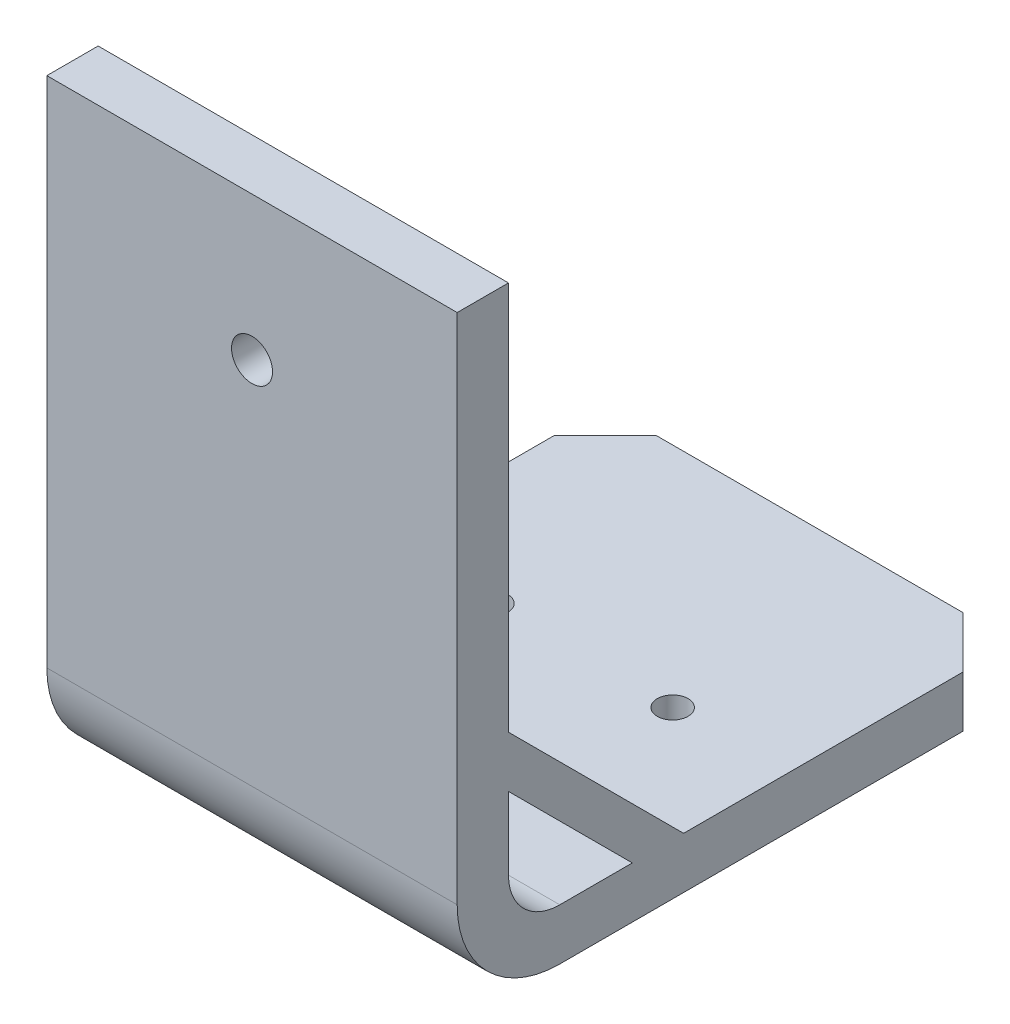
ISO-10303-21;
HEADER;
FILE_DESCRIPTION(('STEP AP214'),'2;1');
FILE_NAME('part.step','',(''),(''),'','','');
FILE_SCHEMA(('AUTOMOTIVE_DESIGN { 1 0 10303 214 1 1 1 1 }'));
ENDSEC;
DATA;
#1=APPLICATION_CONTEXT('core data for automotive mechanical design processes');
#2=APPLICATION_PROTOCOL_DEFINITION('international standard','automotive_design',2000,#1);
#3=PRODUCT_CONTEXT('',#1,'mechanical');
#4=PRODUCT('Part','Part','',(#3));
#5=PRODUCT_RELATED_PRODUCT_CATEGORY('part','',(#4));
#6=PRODUCT_DEFINITION_FORMATION('','',#4);
#7=PRODUCT_DEFINITION_CONTEXT('part definition',#1,'design');
#8=PRODUCT_DEFINITION('design','',#6,#7);
#9=PRODUCT_DEFINITION_SHAPE('','',#8);
#10=(LENGTH_UNIT() NAMED_UNIT(*) SI_UNIT(.MILLI.,.METRE.));
#11=(NAMED_UNIT(*) PLANE_ANGLE_UNIT() SI_UNIT($,.RADIAN.));
#12=(NAMED_UNIT(*) SI_UNIT($,.STERADIAN.) SOLID_ANGLE_UNIT());
#13=UNCERTAINTY_MEASURE_WITH_UNIT(LENGTH_MEASURE(1.E-05),#10,'distance_accuracy_value','');
#14=(GEOMETRIC_REPRESENTATION_CONTEXT(3) GLOBAL_UNCERTAINTY_ASSIGNED_CONTEXT((#13)) GLOBAL_UNIT_ASSIGNED_CONTEXT((#10,
#11,#12)) REPRESENTATION_CONTEXT('',''));
#15=CARTESIAN_POINT('',(0.,0.,0.));
#16=DIRECTION('',(0.,0.,1.));
#17=DIRECTION('',(1.,0.,0.));
#18=AXIS2_PLACEMENT_3D('',#15,#16,#17);
#19=CARTESIAN_POINT('',(0.,5.,0.));
#20=DIRECTION('',(0.,1.,0.));
#21=DIRECTION('',(0.,0.,1.));
#22=AXIS2_PLACEMENT_3D('',#19,#20,#21);
#23=PLANE('',#22);
#24=CARTESIAN_POINT('',(8.78818967932412,5.,0.));
#25=DIRECTION('',(0.,1.,0.));
#26=DIRECTION('',(0.,0.,1.));
#27=AXIS2_PLACEMENT_3D('',#24,#25,#26);
#28=CIRCLE('',#27,1.5);
#29=CARTESIAN_POINT('',(8.78818967932412,5.,1.5));
#30=VERTEX_POINT('',#29);
#31=EDGE_CURVE('E248',#30,#30,#28,.T.);
#32=ORIENTED_EDGE('',*,*,#31,.F.);
#33=EDGE_LOOP('',(#32));
#34=FACE_BOUND('',#33,.T.);
#35=CARTESIAN_POINT('',(-8.78071015741132,5.,0.));
#36=DIRECTION('',(0.,-1.,0.));
#37=DIRECTION('',(0.,0.,-1.));
#38=AXIS2_PLACEMENT_3D('',#35,#36,#37);
#39=CIRCLE('',#38,1.5);
#40=CARTESIAN_POINT('',(-8.78444991836843,5.,-1.49999533805542));
#41=VERTEX_POINT('',#40);
#42=CARTESIAN_POINT('',(-8.78444991836703,5.,1.49999533805542));
#43=VERTEX_POINT('',#42);
#44=EDGE_CURVE('E254',#41,#43,#39,.T.);
#45=ORIENTED_EDGE('',*,*,#44,.T.);
#46=CARTESIAN_POINT('',(-8.78818967932414,5.,0.));
#47=DIRECTION('',(0.,1.,0.));
#48=DIRECTION('',(0.,0.,1.));
#49=AXIS2_PLACEMENT_3D('',#46,#47,#48);
#50=CIRCLE('',#49,1.5);
#51=EDGE_CURVE('E243',#41,#43,#50,.T.);
#52=ORIENTED_EDGE('',*,*,#51,.F.);
#53=EDGE_LOOP('',(#45,#52));
#54=FACE_BOUND('',#53,.T.);
#55=DIRECTION('',(0.,0.,1.));
#56=VECTOR('',#55,1.);
#57=CARTESIAN_POINT('',(-19.9443884596295,5.,-17.1604316218105));
#58=LINE('',#57,#56);
#59=CARTESIAN_POINT('',(-19.9443884596295,5.,-17.1604316218105));
#60=VERTEX_POINT('',#59);
#61=CARTESIAN_POINT('',(-19.9443884596295,5.,10.0893638099451));
#62=VERTEX_POINT('',#61);
#63=EDGE_CURVE('E265',#60,#62,#58,.T.);
#64=ORIENTED_EDGE('',*,*,#63,.T.);
#65=DIRECTION('',(1.,0.,0.));
#66=VECTOR('',#65,1.);
#67=CARTESIAN_POINT('',(-20.0556115403705,5.,10.0893638099451));
#68=LINE('',#67,#66);
#69=CARTESIAN_POINT('',(19.9443884596295,5.,10.0893638099451));
#70=VERTEX_POINT('',#69);
#71=EDGE_CURVE('E329',#62,#70,#68,.T.);
#72=ORIENTED_EDGE('',*,*,#71,.T.);
#73=DIRECTION('',(0.,0.,1.));
#74=VECTOR('',#73,1.);
#75=CARTESIAN_POINT('',(19.9443884596295,5.,-17.1604316218107));
#76=LINE('',#75,#74);
#77=CARTESIAN_POINT('',(19.9443884596295,5.,-17.1604316218107));
#78=VERTEX_POINT('',#77);
#79=EDGE_CURVE('E273',#78,#70,#76,.T.);
#80=ORIENTED_EDGE('',*,*,#79,.F.);
#81=DIRECTION('',(0.707106781186556,0.,0.707106781186539));
#82=VECTOR('',#81,1.);
#83=CARTESIAN_POINT('',(14.9443884596295,5.,-22.1604316218105));
#84=LINE('',#83,#82);
#85=CARTESIAN_POINT('',(14.9443884596295,5.,-22.1604316218105));
#86=VERTEX_POINT('',#85);
#87=EDGE_CURVE('E276',#86,#78,#84,.T.);
#88=ORIENTED_EDGE('',*,*,#87,.F.);
#89=DIRECTION('',(1.,0.,0.));
#90=VECTOR('',#89,1.);
#91=CARTESIAN_POINT('',(-14.9443884596295,5.,-22.1604316218105));
#92=LINE('',#91,#90);
#93=CARTESIAN_POINT('',(-14.9443884596295,5.,-22.1604316218105));
#94=VERTEX_POINT('',#93);
#95=EDGE_CURVE('E279',#94,#86,#92,.T.);
#96=ORIENTED_EDGE('',*,*,#95,.F.);
#97=DIRECTION('',(-0.707106781186542,0.,0.707106781186553));
#98=VECTOR('',#97,1.);
#99=CARTESIAN_POINT('',(-14.9443884596295,5.,-22.1604316218105));
#100=LINE('',#99,#98);
#101=EDGE_CURVE('E260',#94,#60,#100,.T.);
#102=ORIENTED_EDGE('',*,*,#101,.T.);
#103=EDGE_LOOP('',(#64,#72,#80,#88,#96,#102));
#104=FACE_BOUND('',#103,.T.);
#105=ADVANCED_FACE('F46',(#34,#54,#104),#23,.T.);
#106=CARTESIAN_POINT('',(-20.0556115403705,10.,27.1604316218105));
#107=DIRECTION('',(0.,0.,-1.));
#108=DIRECTION('',(-1.,0.,0.));
#109=AXIS2_PLACEMENT_3D('',#106,#107,#108);
#110=PLANE('',#109);
#111=CARTESIAN_POINT('',(-0.0556115403705158,46.,27.1604316218105));
#112=DIRECTION('',(0.,0.,-1.));
#113=DIRECTION('',(-1.,0.,0.));
#114=AXIS2_PLACEMENT_3D('',#111,#112,#113);
#115=CIRCLE('',#114,2.);
#116=CARTESIAN_POINT('',(-2.05561154037052,46.,27.1604316218105));
#117=VERTEX_POINT('',#116);
#118=EDGE_CURVE('E391',#117,#117,#115,.T.);
#119=ORIENTED_EDGE('',*,*,#118,.F.);
#120=EDGE_LOOP('',(#119));
#121=FACE_BOUND('',#120,.T.);
#122=DIRECTION('',(0.,1.,0.));
#123=VECTOR('',#122,1.);
#124=CARTESIAN_POINT('',(19.9443884596295,10.,27.1604316218105));
#125=LINE('',#124,#123);
#126=CARTESIAN_POINT('',(19.9443884596295,22.0710678118655,27.1604316218105));
#127=VERTEX_POINT('',#126);
#128=CARTESIAN_POINT('',(19.9443884596295,60.,27.1604316218105));
#129=VERTEX_POINT('',#128);
#130=EDGE_CURVE('E209',#127,#129,#125,.T.);
#131=ORIENTED_EDGE('',*,*,#130,.F.);
#132=DIRECTION('',(1.,0.,0.));
#133=VECTOR('',#132,1.);
#134=CARTESIAN_POINT('',(-20.0556115403705,22.0710678118655,27.1604316218105));
#135=LINE('',#134,#133);
#136=CARTESIAN_POINT('',(-20.0556115403705,22.0710678118655,27.1604316218105));
#137=VERTEX_POINT('',#136);
#138=EDGE_CURVE('E69',#137,#127,#135,.T.);
#139=ORIENTED_EDGE('',*,*,#138,.F.);
#140=DIRECTION('',(0.,1.,0.));
#141=VECTOR('',#140,1.);
#142=CARTESIAN_POINT('',(-20.0556115403705,10.,27.1604316218105));
#143=LINE('',#142,#141);
#144=CARTESIAN_POINT('',(-20.0556115403705,60.,27.1604316218105));
#145=VERTEX_POINT('',#144);
#146=EDGE_CURVE('E195',#137,#145,#143,.T.);
#147=ORIENTED_EDGE('',*,*,#146,.T.);
#148=DIRECTION('',(1.,0.,0.));
#149=VECTOR('',#148,1.);
#150=CARTESIAN_POINT('',(-20.0556115403705,60.,27.1604316218105));
#151=LINE('',#150,#149);
#152=EDGE_CURVE('E205',#145,#129,#151,.T.);
#153=ORIENTED_EDGE('',*,*,#152,.T.);
#154=EDGE_LOOP('',(#131,#139,#147,#153));
#155=FACE_BOUND('',#154,.T.);
#156=ADVANCED_FACE('F323',(#121,#155),#110,.T.);
#157=CARTESIAN_POINT('',(-8.78071015741132,5.,0.));
#158=DIRECTION('',(0.,-1.,0.));
#159=DIRECTION('',(0.,0.,-1.));
#160=AXIS2_PLACEMENT_3D('',#157,#158,#159);
#161=CYLINDRICAL_SURFACE('',#160,1.5);
#162=DIRECTION('',(0.,-1.,0.));
#163=VECTOR('',#162,1.);
#164=CARTESIAN_POINT('',(-8.78444991836843,2.5,-1.49999533805542));
#165=LINE('',#164,#163);
#166=CARTESIAN_POINT('',(-8.78444991836843,0.,-1.49999533805542));
#167=VERTEX_POINT('',#166);
#168=EDGE_CURVE('E12',#167,#41,#165,.F.);
#169=ORIENTED_EDGE('',*,*,#168,.F.);
#170=CARTESIAN_POINT('',(-8.78071015741132,0.,0.));
#171=DIRECTION('',(0.,-1.,0.));
#172=DIRECTION('',(0.,0.,-1.));
#173=AXIS2_PLACEMENT_3D('',#170,#171,#172);
#174=CIRCLE('',#173,1.5);
#175=CARTESIAN_POINT('',(-8.78444991836703,0.,1.49999533805542));
#176=VERTEX_POINT('',#175);
#177=EDGE_CURVE('E251',#167,#176,#174,.T.);
#178=ORIENTED_EDGE('',*,*,#177,.T.);
#179=DIRECTION('',(0.,-1.,0.));
#180=VECTOR('',#179,1.);
#181=CARTESIAN_POINT('',(-8.78444991836703,2.5,1.49999533805542));
#182=LINE('',#181,#180);
#183=EDGE_CURVE('E54',#43,#176,#182,.T.);
#184=ORIENTED_EDGE('',*,*,#183,.F.);
#185=ORIENTED_EDGE('',*,*,#44,.F.);
#186=EDGE_LOOP('',(#169,#178,#184,#185));
#187=FACE_BOUND('',#186,.T.);
#188=ADVANCED_FACE('F319',(#187),#161,.F.);
#189=CARTESIAN_POINT('',(-14.9443884596295,5.,-22.1604316218105));
#190=DIRECTION('',(0.707106781186553,0.,0.707106781186542));
#191=DIRECTION('',(0.707106781186542,0.,-0.707106781186553));
#192=AXIS2_PLACEMENT_3D('',#189,#190,#191);
#193=PLANE('',#192);
#194=DIRECTION('',(-0.707106781186542,0.,0.707106781186553));
#195=VECTOR('',#194,1.);
#196=CARTESIAN_POINT('',(-14.9443884596295,0.,-22.1604316218105));
#197=LINE('',#196,#195);
#198=CARTESIAN_POINT('',(-14.9443884596295,0.,-22.1604316218105));
#199=VERTEX_POINT('',#198);
#200=CARTESIAN_POINT('',(-19.9443884596295,0.,-17.1604316218105));
#201=VERTEX_POINT('',#200);
#202=EDGE_CURVE('E257',#199,#201,#197,.T.);
#203=ORIENTED_EDGE('',*,*,#202,.T.);
#204=DIRECTION('',(0.,-1.,0.));
#205=VECTOR('',#204,1.);
#206=CARTESIAN_POINT('',(-19.9443884596295,5.,-17.1604316218105));
#207=LINE('',#206,#205);
#208=EDGE_CURVE('E306',#60,#201,#207,.T.);
#209=ORIENTED_EDGE('',*,*,#208,.F.);
#210=ORIENTED_EDGE('',*,*,#101,.F.);
#211=DIRECTION('',(0.,-1.,0.));
#212=VECTOR('',#211,1.);
#213=CARTESIAN_POINT('',(-14.9443884596295,5.,-22.1604316218105));
#214=LINE('',#213,#212);
#215=EDGE_CURVE('E282',#94,#199,#214,.T.);
#216=ORIENTED_EDGE('',*,*,#215,.T.);
#217=EDGE_LOOP('',(#203,#209,#210,#216));
#218=FACE_BOUND('',#217,.T.);
#219=ADVANCED_FACE('F48',(#218),#193,.F.);
#220=CARTESIAN_POINT('',(-19.9443884596295,5.,-17.1604316218105));
#221=DIRECTION('',(1.,0.,0.));
#222=DIRECTION('',(0.,0.,-1.));
#223=AXIS2_PLACEMENT_3D('',#220,#221,#222);
#224=PLANE('',#223);
#225=DIRECTION('',(0.,0.,1.));
#226=VECTOR('',#225,1.);
#227=CARTESIAN_POINT('',(-19.9443884596295,0.,-17.1604316218105));
#228=LINE('',#227,#226);
#229=CARTESIAN_POINT('',(-19.9443884596295,0.,22.1604316218105));
#230=VERTEX_POINT('',#229);
#231=EDGE_CURVE('E285',#201,#230,#228,.T.);
#232=ORIENTED_EDGE('',*,*,#231,.T.);
#233=DIRECTION('',(0.,-1.,0.));
#234=VECTOR('',#233,1.);
#235=CARTESIAN_POINT('',(-19.9443884596295,5.,22.1604316218105));
#236=LINE('',#235,#234);
#237=CARTESIAN_POINT('',(-19.9443884596295,5.,22.1604316218105));
#238=VERTEX_POINT('',#237);
#239=EDGE_CURVE('E303',#238,#230,#236,.T.);
#240=ORIENTED_EDGE('',*,*,#239,.F.);
#241=CARTESIAN_POINT('',(-19.9443884596295,5.,15.0893638099451));
#242=VERTEX_POINT('',#241);
#243=EDGE_CURVE('E263',#242,#238,#58,.T.);
#244=ORIENTED_EDGE('',*,*,#243,.F.);
#245=EDGE_CURVE('E269',#62,#242,#58,.T.);
#246=ORIENTED_EDGE('',*,*,#245,.F.);
#247=ORIENTED_EDGE('',*,*,#63,.F.);
#248=ORIENTED_EDGE('',*,*,#208,.T.);
#249=EDGE_LOOP('',(#232,#240,#244,#246,#247,#248));
#250=FACE_BOUND('',#249,.T.);
#251=ADVANCED_FACE('F335',(#250),#224,.F.);
#252=CARTESIAN_POINT('',(19.9443884596295,5.,-17.1604316218107));
#253=DIRECTION('',(1.,0.,0.));
#254=DIRECTION('',(0.,0.,-1.));
#255=AXIS2_PLACEMENT_3D('',#252,#253,#254);
#256=PLANE('',#255);
#257=DIRECTION('',(0.,-0.707106781186547,-0.707106781186548));
#258=VECTOR('',#257,1.);
#259=CARTESIAN_POINT('',(19.9443884596295,-5.04468190497253,5.04468190497252));
#260=LINE('',#259,#258);
#261=CARTESIAN_POINT('',(19.9443884596295,17.0710678118655,27.1604316218105));
#262=VERTEX_POINT('',#261);
#263=CARTESIAN_POINT('',(19.9443884596295,5.,15.0893638099451));
#264=VERTEX_POINT('',#263);
#265=EDGE_CURVE('E61',#262,#264,#260,.T.);
#266=ORIENTED_EDGE('',*,*,#265,.T.);
#267=CARTESIAN_POINT('',(19.9443884596295,5.,22.1604316218105));
#268=VERTEX_POINT('',#267);
#269=EDGE_CURVE('E272',#264,#268,#76,.T.);
#270=ORIENTED_EDGE('',*,*,#269,.T.);
#271=CARTESIAN_POINT('',(19.9443884596295,10.,22.1604316218105));
#272=DIRECTION('',(-1.,0.,0.));
#273=DIRECTION('',(0.,0.,-1.));
#274=AXIS2_PLACEMENT_3D('',#271,#272,#273);
#275=CIRCLE('',#274,5.);
#276=CARTESIAN_POINT('',(19.9443884596295,10.,27.1604316218105));
#277=VERTEX_POINT('',#276);
#278=EDGE_CURVE('E216',#268,#277,#275,.T.);
#279=ORIENTED_EDGE('',*,*,#278,.T.);
#280=EDGE_CURVE('E206',#277,#262,#125,.T.);
#281=ORIENTED_EDGE('',*,*,#280,.T.);
#282=EDGE_LOOP('',(#266,#270,#279,#281));
#283=FACE_BOUND('',#282,.T.);
#284=DIRECTION('',(0.,0.,1.));
#285=VECTOR('',#284,1.);
#286=CARTESIAN_POINT('',(19.9443884596295,0.,-17.1604316218107));
#287=LINE('',#286,#285);
#288=CARTESIAN_POINT('',(19.9443884596295,0.,-17.1604316218107));
#289=VERTEX_POINT('',#288);
#290=CARTESIAN_POINT('',(19.9443884596295,0.,22.1604316218105));
#291=VERTEX_POINT('',#290);
#292=EDGE_CURVE('E291',#289,#291,#287,.T.);
#293=ORIENTED_EDGE('',*,*,#292,.F.);
#294=DIRECTION('',(0.,-1.,0.));
#295=VECTOR('',#294,1.);
#296=CARTESIAN_POINT('',(19.9443884596295,5.,-17.1604316218107));
#297=LINE('',#296,#295);
#298=EDGE_CURVE('E301',#78,#289,#297,.T.);
#299=ORIENTED_EDGE('',*,*,#298,.F.);
#300=ORIENTED_EDGE('',*,*,#79,.T.);
#301=DIRECTION('',(0.,-0.707106781186547,-0.707106781186548));
#302=VECTOR('',#301,1.);
#303=CARTESIAN_POINT('',(19.9443884596295,-2.54468190497253,2.54468190497252));
#304=LINE('',#303,#302);
#305=EDGE_CURVE('E189',#127,#70,#304,.T.);
#306=ORIENTED_EDGE('',*,*,#305,.F.);
#307=ORIENTED_EDGE('',*,*,#130,.T.);
#308=DIRECTION('',(0.,0.,1.));
#309=VECTOR('',#308,1.);
#310=CARTESIAN_POINT('',(19.9443884596295,60.,32.1604316218105));
#311=LINE('',#310,#309);
#312=CARTESIAN_POINT('',(19.9443884596295,60.,32.1604316218105));
#313=VERTEX_POINT('',#312);
#314=EDGE_CURVE('E208',#129,#313,#311,.T.);
#315=ORIENTED_EDGE('',*,*,#314,.T.);
#316=DIRECTION('',(0.,-1.,0.));
#317=VECTOR('',#316,1.);
#318=CARTESIAN_POINT('',(19.9443884596295,9.99999999999993,32.1604316218105));
#319=LINE('',#318,#317);
#320=CARTESIAN_POINT('',(19.9443884596295,9.99999999999993,32.1604316218105));
#321=VERTEX_POINT('',#320);
#322=EDGE_CURVE('E200',#313,#321,#319,.T.);
#323=ORIENTED_EDGE('',*,*,#322,.T.);
#324=CARTESIAN_POINT('',(19.9443884596295,10.,22.1604316218105));
#325=DIRECTION('',(1.,0.,0.));
#326=DIRECTION('',(0.,0.,-1.));
#327=AXIS2_PLACEMENT_3D('',#324,#325,#326);
#328=CIRCLE('',#327,10.);
#329=EDGE_CURVE('E222',#321,#291,#328,.T.);
#330=ORIENTED_EDGE('',*,*,#329,.T.);
#331=EDGE_LOOP('',(#293,#299,#300,#306,#307,#315,#323,#330));
#332=FACE_BOUND('',#331,.T.);
#333=ADVANCED_FACE('F352',(#283,#332),#256,.T.);
#334=CARTESIAN_POINT('',(14.9443884596295,5.,-22.1604316218105));
#335=DIRECTION('',(0.707106781186539,0.,-0.707106781186556));
#336=DIRECTION('',(-0.707106781186556,0.,-0.707106781186539));
#337=AXIS2_PLACEMENT_3D('',#334,#335,#336);
#338=PLANE('',#337);
#339=DIRECTION('',(0.707106781186556,0.,0.707106781186539));
#340=VECTOR('',#339,1.);
#341=CARTESIAN_POINT('',(14.9443884596295,0.,-22.1604316218105));
#342=LINE('',#341,#340);
#343=CARTESIAN_POINT('',(14.9443884596295,0.,-22.1604316218105));
#344=VERTEX_POINT('',#343);
#345=EDGE_CURVE('E293',#344,#289,#342,.T.);
#346=ORIENTED_EDGE('',*,*,#345,.F.);
#347=DIRECTION('',(0.,-1.,0.));
#348=VECTOR('',#347,1.);
#349=CARTESIAN_POINT('',(14.9443884596295,5.,-22.1604316218105));
#350=LINE('',#349,#348);
#351=EDGE_CURVE('E299',#86,#344,#350,.T.);
#352=ORIENTED_EDGE('',*,*,#351,.F.);
#353=ORIENTED_EDGE('',*,*,#87,.T.);
#354=ORIENTED_EDGE('',*,*,#298,.T.);
#355=EDGE_LOOP('',(#346,#352,#353,#354));
#356=FACE_BOUND('',#355,.T.);
#357=ADVANCED_FACE('F355',(#356),#338,.T.);
#358=CARTESIAN_POINT('',(-14.9443884596295,5.,-22.1604316218105));
#359=DIRECTION('',(0.,0.,-1.));
#360=DIRECTION('',(-1.,0.,0.));
#361=AXIS2_PLACEMENT_3D('',#358,#359,#360);
#362=PLANE('',#361);
#363=DIRECTION('',(1.,0.,0.));
#364=VECTOR('',#363,1.);
#365=CARTESIAN_POINT('',(-14.9443884596295,0.,-22.1604316218105));
#366=LINE('',#365,#364);
#367=EDGE_CURVE('E264',#199,#344,#366,.T.);
#368=ORIENTED_EDGE('',*,*,#367,.F.);
#369=ORIENTED_EDGE('',*,*,#215,.F.);
#370=ORIENTED_EDGE('',*,*,#95,.T.);
#371=ORIENTED_EDGE('',*,*,#351,.T.);
#372=EDGE_LOOP('',(#368,#369,#370,#371));
#373=FACE_BOUND('',#372,.T.);
#374=ADVANCED_FACE('F365',(#373),#362,.T.);
#375=DIRECTION('',(1.,0.,0.));
#376=VECTOR('',#375,1.);
#377=CARTESIAN_POINT('',(-20.0556115403705,5.,15.0893638099451));
#378=LINE('',#377,#376);
#379=EDGE_CURVE('E178',#242,#264,#378,.T.);
#380=ORIENTED_EDGE('',*,*,#379,.F.);
#381=ORIENTED_EDGE('',*,*,#243,.T.);
#382=DIRECTION('',(1.,0.,0.));
#383=VECTOR('',#382,1.);
#384=CARTESIAN_POINT('',(-19.9443884596295,5.,22.1604316218105));
#385=LINE('',#384,#383);
#386=EDGE_CURVE('E268',#238,#268,#385,.T.);
#387=ORIENTED_EDGE('',*,*,#386,.T.);
#388=ORIENTED_EDGE('',*,*,#269,.F.);
#389=EDGE_LOOP('',(#380,#381,#387,#388));
#390=FACE_BOUND('',#389,.T.);
#391=ADVANCED_FACE('F326',(#390),#23,.T.);
#392=CARTESIAN_POINT('',(0.,0.,0.));
#393=DIRECTION('',(0.,1.,0.));
#394=DIRECTION('',(0.,0.,1.));
#395=AXIS2_PLACEMENT_3D('',#392,#393,#394);
#396=PLANE('',#395);
#397=CARTESIAN_POINT('',(-8.78818967932414,0.,0.));
#398=DIRECTION('',(0.,1.,0.));
#399=DIRECTION('',(0.,0.,1.));
#400=AXIS2_PLACEMENT_3D('',#397,#398,#399);
#401=CIRCLE('',#400,1.5);
#402=EDGE_CURVE('E235',#167,#176,#401,.T.);
#403=ORIENTED_EDGE('',*,*,#402,.T.);
#404=ORIENTED_EDGE('',*,*,#177,.F.);
#405=EDGE_LOOP('',(#403,#404));
#406=FACE_BOUND('',#405,.T.);
#407=CARTESIAN_POINT('',(8.78818967932412,0.,0.));
#408=DIRECTION('',(0.,1.,0.));
#409=DIRECTION('',(0.,0.,1.));
#410=AXIS2_PLACEMENT_3D('',#407,#408,#409);
#411=CIRCLE('',#410,1.5);
#412=CARTESIAN_POINT('',(8.78818967932412,0.,1.5));
#413=VERTEX_POINT('',#412);
#414=EDGE_CURVE('E245',#413,#413,#411,.T.);
#415=ORIENTED_EDGE('',*,*,#414,.T.);
#416=EDGE_LOOP('',(#415));
#417=FACE_BOUND('',#416,.T.);
#418=ORIENTED_EDGE('',*,*,#202,.F.);
#419=ORIENTED_EDGE('',*,*,#367,.T.);
#420=ORIENTED_EDGE('',*,*,#345,.T.);
#421=ORIENTED_EDGE('',*,*,#292,.T.);
#422=DIRECTION('',(1.,0.,0.));
#423=VECTOR('',#422,1.);
#424=CARTESIAN_POINT('',(-19.9443884596295,0.,22.1604316218105));
#425=LINE('',#424,#423);
#426=EDGE_CURVE('E288',#230,#291,#425,.T.);
#427=ORIENTED_EDGE('',*,*,#426,.F.);
#428=ORIENTED_EDGE('',*,*,#231,.F.);
#429=EDGE_LOOP('',(#418,#419,#420,#421,#427,#428));
#430=FACE_BOUND('',#429,.T.);
#431=ADVANCED_FACE('F317',(#406,#417,#430),#396,.F.);
#432=CARTESIAN_POINT('',(-8.78818967932414,5.,0.));
#433=DIRECTION('',(0.,-1.,0.));
#434=DIRECTION('',(0.,0.,-1.));
#435=AXIS2_PLACEMENT_3D('',#432,#433,#434);
#436=CYLINDRICAL_SURFACE('',#435,1.5);
#437=ORIENTED_EDGE('',*,*,#168,.T.);
#438=ORIENTED_EDGE('',*,*,#51,.T.);
#439=ORIENTED_EDGE('',*,*,#183,.T.);
#440=ORIENTED_EDGE('',*,*,#402,.F.);
#441=EDGE_LOOP('',(#437,#438,#439,#440));
#442=FACE_BOUND('',#441,.T.);
#443=ADVANCED_FACE('F310',(#442),#436,.F.);
#444=CARTESIAN_POINT('',(8.78818967932412,5.,0.));
#445=DIRECTION('',(0.,-1.,0.));
#446=DIRECTION('',(0.,0.,-1.));
#447=AXIS2_PLACEMENT_3D('',#444,#445,#446);
#448=CYLINDRICAL_SURFACE('',#447,1.5);
#449=ORIENTED_EDGE('',*,*,#31,.T.);
#450=EDGE_LOOP('',(#449));
#451=FACE_BOUND('',#450,.T.);
#452=ORIENTED_EDGE('',*,*,#414,.F.);
#453=EDGE_LOOP('',(#452));
#454=FACE_BOUND('',#453,.T.);
#455=ADVANCED_FACE('F423',(#451,#454),#448,.F.);
#456=CARTESIAN_POINT('',(-20.0556115403705,10.,22.1604316218105));
#457=DIRECTION('',(1.,0.,0.));
#458=DIRECTION('',(0.,0.,-1.));
#459=AXIS2_PLACEMENT_3D('',#456,#457,#458);
#460=CYLINDRICAL_SURFACE('',#459,5.);
#461=ORIENTED_EDGE('',*,*,#278,.F.);
#462=ORIENTED_EDGE('',*,*,#386,.F.);
#463=DIRECTION('',(1.,0.,0.));
#464=VECTOR('',#463,1.);
#465=CARTESIAN_POINT('',(-20.0556115403705,5.,22.1604316218105));
#466=LINE('',#465,#464);
#467=CARTESIAN_POINT('',(-20.0556115403705,5.,22.1604316218105));
#468=VERTEX_POINT('',#467);
#469=EDGE_CURVE('E232',#468,#238,#466,.T.);
#470=ORIENTED_EDGE('',*,*,#469,.F.);
#471=CARTESIAN_POINT('',(-20.0556115403705,10.,22.1604316218105));
#472=DIRECTION('',(-1.,0.,0.));
#473=DIRECTION('',(0.,0.,-1.));
#474=AXIS2_PLACEMENT_3D('',#471,#472,#473);
#475=CIRCLE('',#474,5.);
#476=CARTESIAN_POINT('',(-20.0556115403705,10.,27.1604316218105));
#477=VERTEX_POINT('',#476);
#478=EDGE_CURVE('E219',#468,#477,#475,.T.);
#479=ORIENTED_EDGE('',*,*,#478,.T.);
#480=DIRECTION('',(1.,0.,0.));
#481=VECTOR('',#480,1.);
#482=CARTESIAN_POINT('',(-20.0556115403705,10.,27.1604316218105));
#483=LINE('',#482,#481);
#484=EDGE_CURVE('E193',#477,#277,#483,.T.);
#485=ORIENTED_EDGE('',*,*,#484,.T.);
#486=EDGE_LOOP('',(#461,#462,#470,#479,#485));
#487=FACE_BOUND('',#486,.T.);
#488=ADVANCED_FACE('F347',(#487),#460,.F.);
#489=CARTESIAN_POINT('',(-20.0556115403705,5.,22.1604316218105));
#490=DIRECTION('',(0.,0.,-1.));
#491=DIRECTION('',(-1.,0.,0.));
#492=AXIS2_PLACEMENT_3D('',#489,#490,#491);
#493=PLANE('',#492);
#494=ORIENTED_EDGE('',*,*,#469,.T.);
#495=ORIENTED_EDGE('',*,*,#239,.T.);
#496=DIRECTION('',(1.,0.,0.));
#497=VECTOR('',#496,1.);
#498=CARTESIAN_POINT('',(-20.0556115403705,0.,22.1604316218105));
#499=LINE('',#498,#497);
#500=CARTESIAN_POINT('',(-20.0556115403705,0.,22.1604316218105));
#501=VERTEX_POINT('',#500);
#502=EDGE_CURVE('E236',#501,#230,#499,.T.);
#503=ORIENTED_EDGE('',*,*,#502,.F.);
#504=DIRECTION('',(0.,1.,0.));
#505=VECTOR('',#504,1.);
#506=CARTESIAN_POINT('',(-20.0556115403705,5.,22.1604316218105));
#507=LINE('',#506,#505);
#508=EDGE_CURVE('E225',#501,#468,#507,.T.);
#509=ORIENTED_EDGE('',*,*,#508,.T.);
#510=EDGE_LOOP('',(#494,#495,#503,#509));
#511=FACE_BOUND('',#510,.T.);
#512=ADVANCED_FACE('F348',(#511),#493,.T.);
#513=CARTESIAN_POINT('',(-20.0556115403705,10.,22.1604316218105));
#514=DIRECTION('',(1.,0.,0.));
#515=DIRECTION('',(0.,0.,-1.));
#516=AXIS2_PLACEMENT_3D('',#513,#514,#515);
#517=CYLINDRICAL_SURFACE('',#516,10.);
#518=ORIENTED_EDGE('',*,*,#329,.F.);
#519=DIRECTION('',(1.,0.,0.));
#520=VECTOR('',#519,1.);
#521=CARTESIAN_POINT('',(-20.0556115403705,10.,32.1604316218105));
#522=LINE('',#521,#520);
#523=CARTESIAN_POINT('',(-20.0556115403705,10.,32.1604316218105));
#524=VERTEX_POINT('',#523);
#525=EDGE_CURVE('E239',#524,#321,#522,.T.);
#526=ORIENTED_EDGE('',*,*,#525,.F.);
#527=CARTESIAN_POINT('',(-20.0556115403705,10.,22.1604316218105));
#528=DIRECTION('',(1.,0.,0.));
#529=DIRECTION('',(0.,0.,-1.));
#530=AXIS2_PLACEMENT_3D('',#527,#528,#529);
#531=CIRCLE('',#530,10.);
#532=EDGE_CURVE('E221',#524,#501,#531,.T.);
#533=ORIENTED_EDGE('',*,*,#532,.T.);
#534=ORIENTED_EDGE('',*,*,#502,.T.);
#535=ORIENTED_EDGE('',*,*,#426,.T.);
#536=EDGE_LOOP('',(#518,#526,#533,#534,#535));
#537=FACE_BOUND('',#536,.T.);
#538=ADVANCED_FACE('F368',(#537),#517,.T.);
#539=CARTESIAN_POINT('',(-20.0556115403705,10.,22.1604316218105));
#540=DIRECTION('',(1.,0.,0.));
#541=DIRECTION('',(0.,0.,-1.));
#542=AXIS2_PLACEMENT_3D('',#539,#540,#541);
#543=PLANE('',#542);
#544=ORIENTED_EDGE('',*,*,#478,.F.);
#545=ORIENTED_EDGE('',*,*,#508,.F.);
#546=ORIENTED_EDGE('',*,*,#532,.F.);
#547=DIRECTION('',(0.,-1.,0.));
#548=VECTOR('',#547,1.);
#549=CARTESIAN_POINT('',(-20.0556115403705,9.99999999999993,32.1604316218105));
#550=LINE('',#549,#548);
#551=CARTESIAN_POINT('',(-20.0556115403705,60.,32.1604316218105));
#552=VERTEX_POINT('',#551);
#553=EDGE_CURVE('E198',#552,#524,#550,.T.);
#554=ORIENTED_EDGE('',*,*,#553,.F.);
#555=DIRECTION('',(0.,0.,1.));
#556=VECTOR('',#555,1.);
#557=CARTESIAN_POINT('',(-20.0556115403705,60.,32.1604316218105));
#558=LINE('',#557,#556);
#559=EDGE_CURVE('E194',#145,#552,#558,.T.);
#560=ORIENTED_EDGE('',*,*,#559,.F.);
#561=ORIENTED_EDGE('',*,*,#146,.F.);
#562=DIRECTION('',(0.,-0.707106781186547,-0.707106781186548));
#563=VECTOR('',#562,1.);
#564=CARTESIAN_POINT('',(-20.0556115403705,-2.54468190497253,2.54468190497253));
#565=LINE('',#564,#563);
#566=CARTESIAN_POINT('',(-20.0556115403705,5.,10.0893638099451));
#567=VERTEX_POINT('',#566);
#568=EDGE_CURVE('E179',#137,#567,#565,.T.);
#569=ORIENTED_EDGE('',*,*,#568,.T.);
#570=DIRECTION('',(0.,0.,1.));
#571=VECTOR('',#570,1.);
#572=CARTESIAN_POINT('',(-20.0556115403705,5.,0.));
#573=LINE('',#572,#571);
#574=CARTESIAN_POINT('',(-20.0556115403705,5.,15.0893638099451));
#575=VERTEX_POINT('',#574);
#576=EDGE_CURVE('E187',#567,#575,#573,.T.);
#577=ORIENTED_EDGE('',*,*,#576,.T.);
#578=DIRECTION('',(0.,-0.707106781186547,-0.707106781186548));
#579=VECTOR('',#578,1.);
#580=CARTESIAN_POINT('',(-20.0556115403705,-5.04468190497253,5.04468190497253));
#581=LINE('',#580,#579);
#582=CARTESIAN_POINT('',(-20.0556115403705,17.0710678118655,27.1604316218105));
#583=VERTEX_POINT('',#582);
#584=EDGE_CURVE('E174',#583,#575,#581,.T.);
#585=ORIENTED_EDGE('',*,*,#584,.F.);
#586=EDGE_CURVE('E185',#477,#583,#143,.T.);
#587=ORIENTED_EDGE('',*,*,#586,.F.);
#588=EDGE_LOOP('',(#544,#545,#546,#554,#560,#561,#569,#577,#585,#587));
#589=FACE_BOUND('',#588,.T.);
#590=ADVANCED_FACE('F184',(#589),#543,.F.);
#591=CARTESIAN_POINT('',(-20.0556115403705,9.99999999999993,32.1604316218105));
#592=DIRECTION('',(0.,0.,1.));
#593=DIRECTION('',(1.,0.,0.));
#594=AXIS2_PLACEMENT_3D('',#591,#592,#593);
#595=PLANE('',#594);
#596=CARTESIAN_POINT('',(-0.0556115403705158,46.,32.1604316218105));
#597=DIRECTION('',(0.,0.,1.));
#598=DIRECTION('',(1.,0.,0.));
#599=AXIS2_PLACEMENT_3D('',#596,#597,#598);
#600=CIRCLE('',#599,2.);
#601=CARTESIAN_POINT('',(1.94438845962948,46.,32.1604316218105));
#602=VERTEX_POINT('',#601);
#603=EDGE_CURVE('E393',#602,#602,#600,.T.);
#604=ORIENTED_EDGE('',*,*,#603,.F.);
#605=EDGE_LOOP('',(#604));
#606=FACE_BOUND('',#605,.T.);
#607=ORIENTED_EDGE('',*,*,#322,.F.);
#608=DIRECTION('',(1.,0.,0.));
#609=VECTOR('',#608,1.);
#610=CARTESIAN_POINT('',(-20.0556115403705,60.,32.1604316218105));
#611=LINE('',#610,#609);
#612=EDGE_CURVE('E214',#552,#313,#611,.T.);
#613=ORIENTED_EDGE('',*,*,#612,.F.);
#614=ORIENTED_EDGE('',*,*,#553,.T.);
#615=ORIENTED_EDGE('',*,*,#525,.T.);
#616=EDGE_LOOP('',(#607,#613,#614,#615));
#617=FACE_BOUND('',#616,.T.);
#618=ADVANCED_FACE('F371',(#606,#617),#595,.T.);
#619=CARTESIAN_POINT('',(-20.0556115403705,60.,32.1604316218105));
#620=DIRECTION('',(0.,1.,0.));
#621=DIRECTION('',(0.,0.,1.));
#622=AXIS2_PLACEMENT_3D('',#619,#620,#621);
#623=PLANE('',#622);
#624=ORIENTED_EDGE('',*,*,#314,.F.);
#625=ORIENTED_EDGE('',*,*,#152,.F.);
#626=ORIENTED_EDGE('',*,*,#559,.T.);
#627=ORIENTED_EDGE('',*,*,#612,.T.);
#628=EDGE_LOOP('',(#624,#625,#626,#627));
#629=FACE_BOUND('',#628,.T.);
#630=ADVANCED_FACE('F376',(#629),#623,.T.);
#631=DIRECTION('',(1.,0.,0.));
#632=VECTOR('',#631,1.);
#633=CARTESIAN_POINT('',(-20.0556115403705,17.0710678118655,27.1604316218105));
#634=LINE('',#633,#632);
#635=EDGE_CURVE('E170',#583,#262,#634,.T.);
#636=ORIENTED_EDGE('',*,*,#635,.T.);
#637=ORIENTED_EDGE('',*,*,#280,.F.);
#638=ORIENTED_EDGE('',*,*,#484,.F.);
#639=ORIENTED_EDGE('',*,*,#586,.T.);
#640=EDGE_LOOP('',(#636,#637,#638,#639));
#641=FACE_BOUND('',#640,.T.);
#642=ADVANCED_FACE('F192',(#641),#110,.T.);
#643=CARTESIAN_POINT('',(-20.0556115403705,5.,0.));
#644=DIRECTION('',(0.,1.,0.));
#645=DIRECTION('',(0.,0.,1.));
#646=AXIS2_PLACEMENT_3D('',#643,#644,#645);
#647=PLANE('',#646);
#648=EDGE_CURVE('E381',#567,#62,#68,.T.);
#649=ORIENTED_EDGE('',*,*,#648,.T.);
#650=ORIENTED_EDGE('',*,*,#245,.T.);
#651=EDGE_CURVE('E386',#575,#242,#378,.T.);
#652=ORIENTED_EDGE('',*,*,#651,.F.);
#653=ORIENTED_EDGE('',*,*,#576,.F.);
#654=EDGE_LOOP('',(#649,#650,#652,#653));
#655=FACE_BOUND('',#654,.T.);
#656=ADVANCED_FACE('F387',(#655),#647,.F.);
#657=CARTESIAN_POINT('',(-20.0556115403705,-2.54468190497253,2.54468190497253));
#658=DIRECTION('',(0.,-0.707106781186548,0.707106781186547));
#659=DIRECTION('',(0.,-0.707106781186547,-0.707106781186548));
#660=AXIS2_PLACEMENT_3D('',#657,#658,#659);
#661=PLANE('',#660);
#662=ORIENTED_EDGE('',*,*,#305,.T.);
#663=ORIENTED_EDGE('',*,*,#71,.F.);
#664=ORIENTED_EDGE('',*,*,#648,.F.);
#665=ORIENTED_EDGE('',*,*,#568,.F.);
#666=ORIENTED_EDGE('',*,*,#138,.T.);
#667=EDGE_LOOP('',(#662,#663,#664,#665,#666));
#668=FACE_BOUND('',#667,.T.);
#669=ADVANCED_FACE('F530',(#668),#661,.F.);
#670=CARTESIAN_POINT('',(-20.0556115403705,-5.04468190497253,5.04468190497253));
#671=DIRECTION('',(0.,-0.707106781186548,0.707106781186547));
#672=DIRECTION('',(0.,-0.707106781186547,-0.707106781186548));
#673=AXIS2_PLACEMENT_3D('',#670,#671,#672);
#674=PLANE('',#673);
#675=ORIENTED_EDGE('',*,*,#265,.F.);
#676=ORIENTED_EDGE('',*,*,#635,.F.);
#677=ORIENTED_EDGE('',*,*,#584,.T.);
#678=ORIENTED_EDGE('',*,*,#651,.T.);
#679=ORIENTED_EDGE('',*,*,#379,.T.);
#680=EDGE_LOOP('',(#675,#676,#677,#678,#679));
#681=FACE_BOUND('',#680,.T.);
#682=ADVANCED_FACE('F172',(#681),#674,.T.);
#683=CARTESIAN_POINT('',(-0.0556115403705158,46.,-22.1604316218105));
#684=DIRECTION('',(0.,0.,1.));
#685=DIRECTION('',(1.,0.,0.));
#686=AXIS2_PLACEMENT_3D('',#683,#684,#685);
#687=CYLINDRICAL_SURFACE('',#686,2.);
#688=ORIENTED_EDGE('',*,*,#118,.T.);
#689=EDGE_LOOP('',(#688));
#690=FACE_BOUND('',#689,.T.);
#691=ORIENTED_EDGE('',*,*,#603,.T.);
#692=EDGE_LOOP('',(#691));
#693=FACE_BOUND('',#692,.T.);
#694=ADVANCED_FACE('F400',(#690,#693),#687,.F.);
#695=CLOSED_SHELL('',(#105,#156,#188,#219,#251,#333,#357,#374,#391,#431,#443,#455,#488,#512,
#538,#590,#618,#630,#642,#656,#669,#682,#694));
#696=MANIFOLD_SOLID_BREP('B2',#695);
#697=ADVANCED_BREP_SHAPE_REPRESENTATION('',(#18,#696),#14);
#698=SHAPE_DEFINITION_REPRESENTATION(#9,#697);
ENDSEC;
END-ISO-10303-21;
